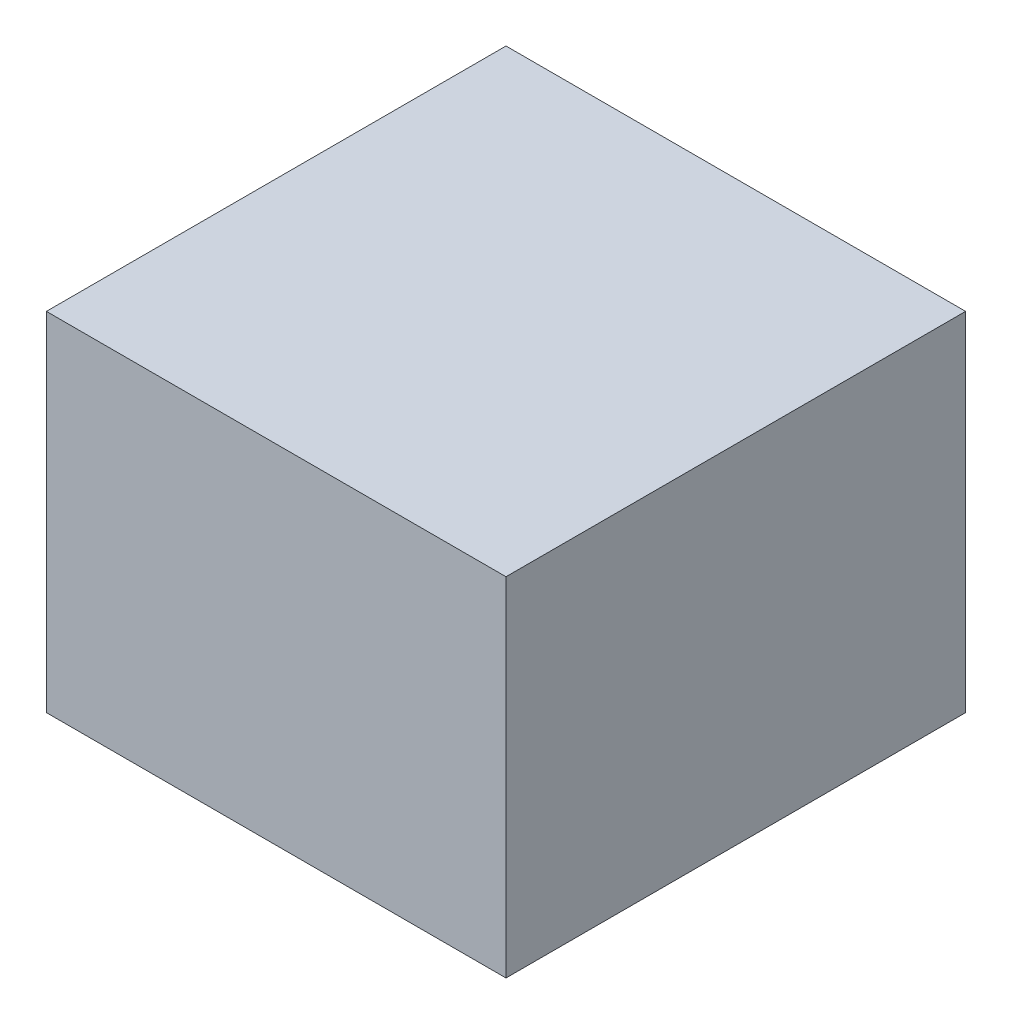
ISO-10303-21;
HEADER;
FILE_DESCRIPTION(('STEP AP214'),'2;1');
FILE_NAME('part.step','',(''),(''),'','','');
FILE_SCHEMA(('AUTOMOTIVE_DESIGN { 1 0 10303 214 1 1 1 1 }'));
ENDSEC;
DATA;
#1=APPLICATION_CONTEXT('core data for automotive mechanical design processes');
#2=APPLICATION_PROTOCOL_DEFINITION('international standard','automotive_design',2000,#1);
#3=PRODUCT_CONTEXT('',#1,'mechanical');
#4=PRODUCT('Part','Part','',(#3));
#5=PRODUCT_RELATED_PRODUCT_CATEGORY('part','',(#4));
#6=PRODUCT_DEFINITION_FORMATION('','',#4);
#7=PRODUCT_DEFINITION_CONTEXT('part definition',#1,'design');
#8=PRODUCT_DEFINITION('design','',#6,#7);
#9=PRODUCT_DEFINITION_SHAPE('','',#8);
#10=(LENGTH_UNIT() NAMED_UNIT(*) SI_UNIT(.MILLI.,.METRE.));
#11=(NAMED_UNIT(*) PLANE_ANGLE_UNIT() SI_UNIT($,.RADIAN.));
#12=(NAMED_UNIT(*) SI_UNIT($,.STERADIAN.) SOLID_ANGLE_UNIT());
#13=UNCERTAINTY_MEASURE_WITH_UNIT(LENGTH_MEASURE(1.E-05),#10,'distance_accuracy_value','');
#14=(GEOMETRIC_REPRESENTATION_CONTEXT(3) GLOBAL_UNCERTAINTY_ASSIGNED_CONTEXT((#13)) GLOBAL_UNIT_ASSIGNED_CONTEXT((#10,
#11,#12)) REPRESENTATION_CONTEXT('',''));
#15=CARTESIAN_POINT('',(0.,0.,0.));
#16=DIRECTION('',(0.,0.,1.));
#17=DIRECTION('',(1.,0.,0.));
#18=AXIS2_PLACEMENT_3D('',#15,#16,#17);
#19=CARTESIAN_POINT('',(41.,62.,-41.));
#20=DIRECTION('',(-1.,0.,0.));
#21=DIRECTION('',(0.,0.,1.));
#22=AXIS2_PLACEMENT_3D('',#19,#20,#21);
#23=PLANE('',#22);
#24=DIRECTION('',(0.,0.,-1.));
#25=VECTOR('',#24,1.);
#26=CARTESIAN_POINT('',(41.,0.,-41.));
#27=LINE('',#26,#25);
#28=CARTESIAN_POINT('',(41.,0.,41.));
#29=VERTEX_POINT('',#28);
#30=CARTESIAN_POINT('',(41.,0.,-41.));
#31=VERTEX_POINT('',#30);
#32=EDGE_CURVE('E111',#29,#31,#27,.T.);
#33=ORIENTED_EDGE('',*,*,#32,.T.);
#34=DIRECTION('',(0.,-1.,0.));
#35=VECTOR('',#34,1.);
#36=CARTESIAN_POINT('',(41.,62.,-41.));
#37=LINE('',#36,#35);
#38=CARTESIAN_POINT('',(41.,62.,-41.));
#39=VERTEX_POINT('',#38);
#40=EDGE_CURVE('E11',#39,#31,#37,.T.);
#41=ORIENTED_EDGE('',*,*,#40,.F.);
#42=DIRECTION('',(0.,0.,-1.));
#43=VECTOR('',#42,1.);
#44=CARTESIAN_POINT('',(41.,62.,-41.));
#45=LINE('',#44,#43);
#46=CARTESIAN_POINT('',(41.,62.,41.));
#47=VERTEX_POINT('',#46);
#48=EDGE_CURVE('E95',#47,#39,#45,.T.);
#49=ORIENTED_EDGE('',*,*,#48,.F.);
#50=DIRECTION('',(0.,-1.,0.));
#51=VECTOR('',#50,1.);
#52=CARTESIAN_POINT('',(41.,62.,41.));
#53=LINE('',#52,#51);
#54=EDGE_CURVE('E107',#47,#29,#53,.T.);
#55=ORIENTED_EDGE('',*,*,#54,.T.);
#56=EDGE_LOOP('',(#33,#41,#49,#55));
#57=FACE_BOUND('',#56,.T.);
#58=ADVANCED_FACE('F43',(#57),#23,.F.);
#59=CARTESIAN_POINT('',(-41.,62.,-41.));
#60=DIRECTION('',(0.,0.,1.));
#61=DIRECTION('',(1.,0.,0.));
#62=AXIS2_PLACEMENT_3D('',#59,#60,#61);
#63=PLANE('',#62);
#64=DIRECTION('',(-1.,0.,0.));
#65=VECTOR('',#64,1.);
#66=CARTESIAN_POINT('',(-41.,0.,-41.));
#67=LINE('',#66,#65);
#68=CARTESIAN_POINT('',(-41.,0.,-41.));
#69=VERTEX_POINT('',#68);
#70=EDGE_CURVE('E100',#31,#69,#67,.T.);
#71=ORIENTED_EDGE('',*,*,#70,.T.);
#72=DIRECTION('',(0.,-1.,0.));
#73=VECTOR('',#72,1.);
#74=CARTESIAN_POINT('',(-41.,62.,-41.));
#75=LINE('',#74,#73);
#76=CARTESIAN_POINT('',(-41.,62.,-41.));
#77=VERTEX_POINT('',#76);
#78=EDGE_CURVE('E52',#77,#69,#75,.T.);
#79=ORIENTED_EDGE('',*,*,#78,.F.);
#80=DIRECTION('',(-1.,0.,0.));
#81=VECTOR('',#80,1.);
#82=CARTESIAN_POINT('',(-41.,62.,-41.));
#83=LINE('',#82,#81);
#84=EDGE_CURVE('E90',#39,#77,#83,.T.);
#85=ORIENTED_EDGE('',*,*,#84,.F.);
#86=ORIENTED_EDGE('',*,*,#40,.T.);
#87=EDGE_LOOP('',(#71,#79,#85,#86));
#88=FACE_BOUND('',#87,.T.);
#89=ADVANCED_FACE('F99',(#88),#63,.F.);
#90=CARTESIAN_POINT('',(-41.,62.,-41.));
#91=DIRECTION('',(1.,0.,0.));
#92=DIRECTION('',(0.,0.,-1.));
#93=AXIS2_PLACEMENT_3D('',#90,#91,#92);
#94=PLANE('',#93);
#95=DIRECTION('',(0.,0.,1.));
#96=VECTOR('',#95,1.);
#97=CARTESIAN_POINT('',(-41.,0.,-41.));
#98=LINE('',#97,#96);
#99=CARTESIAN_POINT('',(-41.,0.,41.));
#100=VERTEX_POINT('',#99);
#101=EDGE_CURVE('E77',#69,#100,#98,.T.);
#102=ORIENTED_EDGE('',*,*,#101,.T.);
#103=DIRECTION('',(0.,-1.,0.));
#104=VECTOR('',#103,1.);
#105=CARTESIAN_POINT('',(-41.,62.,41.));
#106=LINE('',#105,#104);
#107=CARTESIAN_POINT('',(-41.,62.,41.));
#108=VERTEX_POINT('',#107);
#109=EDGE_CURVE('E102',#108,#100,#106,.T.);
#110=ORIENTED_EDGE('',*,*,#109,.F.);
#111=DIRECTION('',(0.,0.,1.));
#112=VECTOR('',#111,1.);
#113=CARTESIAN_POINT('',(-41.,62.,-41.));
#114=LINE('',#113,#112);
#115=EDGE_CURVE('E93',#77,#108,#114,.T.);
#116=ORIENTED_EDGE('',*,*,#115,.F.);
#117=ORIENTED_EDGE('',*,*,#78,.T.);
#118=EDGE_LOOP('',(#102,#110,#116,#117));
#119=FACE_BOUND('',#118,.T.);
#120=ADVANCED_FACE('F103',(#119),#94,.F.);
#121=CARTESIAN_POINT('',(-41.,62.,41.));
#122=DIRECTION('',(0.,0.,-1.));
#123=DIRECTION('',(-1.,0.,0.));
#124=AXIS2_PLACEMENT_3D('',#121,#122,#123);
#125=PLANE('',#124);
#126=DIRECTION('',(1.,0.,0.));
#127=VECTOR('',#126,1.);
#128=CARTESIAN_POINT('',(-41.,0.,41.));
#129=LINE('',#128,#127);
#130=EDGE_CURVE('E83',#100,#29,#129,.T.);
#131=ORIENTED_EDGE('',*,*,#130,.T.);
#132=ORIENTED_EDGE('',*,*,#54,.F.);
#133=DIRECTION('',(1.,0.,0.));
#134=VECTOR('',#133,1.);
#135=CARTESIAN_POINT('',(-41.,62.,41.));
#136=LINE('',#135,#134);
#137=EDGE_CURVE('E60',#108,#47,#136,.T.);
#138=ORIENTED_EDGE('',*,*,#137,.F.);
#139=ORIENTED_EDGE('',*,*,#109,.T.);
#140=EDGE_LOOP('',(#131,#132,#138,#139));
#141=FACE_BOUND('',#140,.T.);
#142=ADVANCED_FACE('F124',(#141),#125,.F.);
#143=CARTESIAN_POINT('',(0.,62.,0.));
#144=DIRECTION('',(0.,1.,0.));
#145=DIRECTION('',(0.,0.,1.));
#146=AXIS2_PLACEMENT_3D('',#143,#144,#145);
#147=PLANE('',#146);
#148=ORIENTED_EDGE('',*,*,#48,.T.);
#149=ORIENTED_EDGE('',*,*,#84,.T.);
#150=ORIENTED_EDGE('',*,*,#115,.T.);
#151=ORIENTED_EDGE('',*,*,#137,.T.);
#152=EDGE_LOOP('',(#148,#149,#150,#151));
#153=FACE_BOUND('',#152,.T.);
#154=ADVANCED_FACE('F91',(#153),#147,.T.);
#155=CARTESIAN_POINT('',(0.,0.,0.));
#156=DIRECTION('',(0.,1.,0.));
#157=DIRECTION('',(0.,0.,1.));
#158=AXIS2_PLACEMENT_3D('',#155,#156,#157);
#159=PLANE('',#158);
#160=ORIENTED_EDGE('',*,*,#32,.F.);
#161=ORIENTED_EDGE('',*,*,#130,.F.);
#162=ORIENTED_EDGE('',*,*,#101,.F.);
#163=ORIENTED_EDGE('',*,*,#70,.F.);
#164=EDGE_LOOP('',(#160,#161,#162,#163));
#165=FACE_BOUND('',#164,.T.);
#166=ADVANCED_FACE('F127',(#165),#159,.F.);
#167=CLOSED_SHELL('',(#58,#89,#120,#142,#154,#166));
#168=MANIFOLD_SOLID_BREP('B2',#167);
#169=ADVANCED_BREP_SHAPE_REPRESENTATION('',(#18,#168),#14);
#170=SHAPE_DEFINITION_REPRESENTATION(#9,#169);
ENDSEC;
END-ISO-10303-21;
